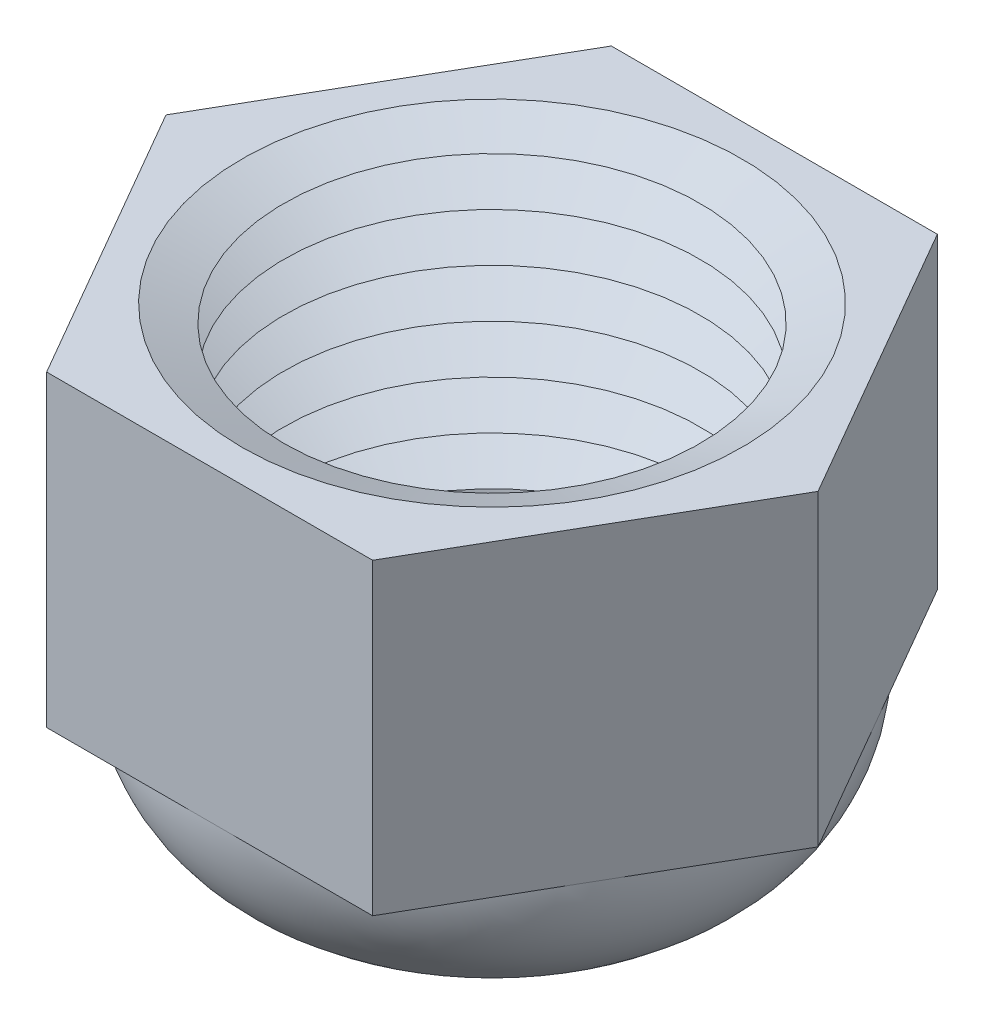
ISO-10303-21;
HEADER;
FILE_DESCRIPTION(('STEP AP214'),'2;1');
FILE_NAME('part.step','',(''),(''),'','','');
FILE_SCHEMA(('AUTOMOTIVE_DESIGN { 1 0 10303 214 1 1 1 1 }'));
ENDSEC;
DATA;
#1=APPLICATION_CONTEXT('core data for automotive mechanical design processes');
#2=APPLICATION_PROTOCOL_DEFINITION('international standard','automotive_design',2000,#1);
#3=PRODUCT_CONTEXT('',#1,'mechanical');
#4=PRODUCT('Part','Part','',(#3));
#5=PRODUCT_RELATED_PRODUCT_CATEGORY('part','',(#4));
#6=PRODUCT_DEFINITION_FORMATION('','',#4);
#7=PRODUCT_DEFINITION_CONTEXT('part definition',#1,'design');
#8=PRODUCT_DEFINITION('design','',#6,#7);
#9=PRODUCT_DEFINITION_SHAPE('','',#8);
#10=(LENGTH_UNIT() NAMED_UNIT(*) SI_UNIT(.MILLI.,.METRE.));
#11=(NAMED_UNIT(*) PLANE_ANGLE_UNIT() SI_UNIT($,.RADIAN.));
#12=(NAMED_UNIT(*) SI_UNIT($,.STERADIAN.) SOLID_ANGLE_UNIT());
#13=UNCERTAINTY_MEASURE_WITH_UNIT(LENGTH_MEASURE(1.E-05),#10,'distance_accuracy_value','');
#14=(GEOMETRIC_REPRESENTATION_CONTEXT(3) GLOBAL_UNCERTAINTY_ASSIGNED_CONTEXT((#13)) GLOBAL_UNIT_ASSIGNED_CONTEXT((#10,
#11,#12)) REPRESENTATION_CONTEXT('',''));
#15=CARTESIAN_POINT('',(0.,0.,0.));
#16=DIRECTION('',(0.,0.,1.));
#17=DIRECTION('',(1.,0.,0.));
#18=AXIS2_PLACEMENT_3D('',#15,#16,#17);
#19=CARTESIAN_POINT('',(10.9696551146029,-5.18,0.));
#20=DIRECTION('',(0.,1.,0.));
#21=DIRECTION('',(0.,0.,1.));
#22=AXIS2_PLACEMENT_3D('',#19,#20,#21);
#23=PLANE('',#22);
#24=CARTESIAN_POINT('',(0.,-5.18,0.));
#25=DIRECTION('',(0.,-1.,0.));
#26=DIRECTION('',(0.,0.,-1.));
#27=AXIS2_PLACEMENT_3D('',#24,#25,#26);
#28=CIRCLE('',#27,9.50000000000001);
#29=CARTESIAN_POINT('',(0.,-5.18,-9.50000000000001));
#30=VERTEX_POINT('',#29);
#31=CARTESIAN_POINT('',(8.22724133595217,-5.18,-4.75));
#32=VERTEX_POINT('',#31);
#33=EDGE_CURVE('E127',#30,#32,#28,.T.);
#34=ORIENTED_EDGE('',*,*,#33,.F.);
#35=DIRECTION('',(-1.,0.,0.));
#36=VECTOR('',#35,1.);
#37=CARTESIAN_POINT('',(5.48482755730144,-5.18,-9.50000000000002));
#38=LINE('',#37,#36);
#39=CARTESIAN_POINT('',(5.48482755730144,-5.18,-9.50000000000002));
#40=VERTEX_POINT('',#39);
#41=EDGE_CURVE('E105',#40,#30,#38,.T.);
#42=ORIENTED_EDGE('',*,*,#41,.F.);
#43=DIRECTION('',(-0.5,0.,-0.866025403784439));
#44=VECTOR('',#43,1.);
#45=CARTESIAN_POINT('',(10.9696551146029,-5.18,0.));
#46=LINE('',#45,#44);
#47=EDGE_CURVE('E128',#32,#40,#46,.T.);
#48=ORIENTED_EDGE('',*,*,#47,.F.);
#49=EDGE_LOOP('',(#34,#42,#48));
#50=FACE_BOUND('',#49,.T.);
#51=ADVANCED_FACE('F32',(#50),#23,.F.);
#52=CARTESIAN_POINT('',(8.22724133595217,-5.18,4.75));
#53=VERTEX_POINT('',#52);
#54=EDGE_CURVE('E40',#32,#53,#28,.T.);
#55=ORIENTED_EDGE('',*,*,#54,.F.);
#56=CARTESIAN_POINT('',(10.9696551146029,-5.18,0.));
#57=VERTEX_POINT('',#56);
#58=EDGE_CURVE('E125',#57,#32,#46,.T.);
#59=ORIENTED_EDGE('',*,*,#58,.F.);
#60=DIRECTION('',(0.5,0.,-0.866025403784439));
#61=VECTOR('',#60,1.);
#62=CARTESIAN_POINT('',(5.48482755730145,-5.18,9.50000000000001));
#63=LINE('',#62,#61);
#64=EDGE_CURVE('E180',#53,#57,#63,.T.);
#65=ORIENTED_EDGE('',*,*,#64,.F.);
#66=EDGE_LOOP('',(#55,#59,#65));
#67=FACE_BOUND('',#66,.T.);
#68=ADVANCED_FACE('F236',(#67),#23,.F.);
#69=CARTESIAN_POINT('',(0.,-5.18,9.50000000000001));
#70=VERTEX_POINT('',#69);
#71=EDGE_CURVE('E269',#53,#70,#28,.T.);
#72=ORIENTED_EDGE('',*,*,#71,.F.);
#73=CARTESIAN_POINT('',(5.48482755730145,-5.18,9.50000000000001));
#74=VERTEX_POINT('',#73);
#75=EDGE_CURVE('E196',#74,#53,#63,.T.);
#76=ORIENTED_EDGE('',*,*,#75,.F.);
#77=DIRECTION('',(1.,0.,0.));
#78=VECTOR('',#77,1.);
#79=CARTESIAN_POINT('',(-5.48482755730145,-5.18,9.50000000000001));
#80=LINE('',#79,#78);
#81=EDGE_CURVE('E205',#70,#74,#80,.T.);
#82=ORIENTED_EDGE('',*,*,#81,.F.);
#83=EDGE_LOOP('',(#72,#76,#82));
#84=FACE_BOUND('',#83,.T.);
#85=ADVANCED_FACE('F241',(#84),#23,.F.);
#86=CARTESIAN_POINT('',(-8.22724133595218,-5.18,4.75000000000001));
#87=VERTEX_POINT('',#86);
#88=EDGE_CURVE('E135',#70,#87,#28,.T.);
#89=ORIENTED_EDGE('',*,*,#88,.F.);
#90=CARTESIAN_POINT('',(-5.48482755730145,-5.18,9.50000000000001));
#91=VERTEX_POINT('',#90);
#92=EDGE_CURVE('E185',#91,#70,#80,.T.);
#93=ORIENTED_EDGE('',*,*,#92,.F.);
#94=DIRECTION('',(0.5,0.,0.866025403784439));
#95=VECTOR('',#94,1.);
#96=CARTESIAN_POINT('',(-10.9696551146029,-5.18,0.));
#97=LINE('',#96,#95);
#98=EDGE_CURVE('E201',#87,#91,#97,.T.);
#99=ORIENTED_EDGE('',*,*,#98,.F.);
#100=EDGE_LOOP('',(#89,#93,#99));
#101=FACE_BOUND('',#100,.T.);
#102=ADVANCED_FACE('F253',(#101),#23,.F.);
#103=CARTESIAN_POINT('',(-8.22724133595218,-5.18,-4.75));
#104=VERTEX_POINT('',#103);
#105=EDGE_CURVE('E54',#87,#104,#28,.T.);
#106=ORIENTED_EDGE('',*,*,#105,.F.);
#107=CARTESIAN_POINT('',(-10.9696551146029,-5.18,0.));
#108=VERTEX_POINT('',#107);
#109=EDGE_CURVE('E202',#108,#87,#97,.T.);
#110=ORIENTED_EDGE('',*,*,#109,.F.);
#111=DIRECTION('',(-0.5,0.,0.866025403784439));
#112=VECTOR('',#111,1.);
#113=CARTESIAN_POINT('',(-5.48482755730145,-5.18,-9.50000000000002));
#114=LINE('',#113,#112);
#115=EDGE_CURVE('E116',#104,#108,#114,.T.);
#116=ORIENTED_EDGE('',*,*,#115,.F.);
#117=EDGE_LOOP('',(#106,#110,#116));
#118=FACE_BOUND('',#117,.T.);
#119=ADVANCED_FACE('F246',(#118),#23,.F.);
#120=EDGE_CURVE('E121',#104,#30,#28,.T.);
#121=ORIENTED_EDGE('',*,*,#120,.F.);
#122=CARTESIAN_POINT('',(-5.48482755730145,-5.18,-9.50000000000002));
#123=VERTEX_POINT('',#122);
#124=EDGE_CURVE('E124',#123,#104,#114,.T.);
#125=ORIENTED_EDGE('',*,*,#124,.F.);
#126=EDGE_CURVE('E109',#30,#123,#38,.T.);
#127=ORIENTED_EDGE('',*,*,#126,.F.);
#128=EDGE_LOOP('',(#121,#125,#127));
#129=FACE_BOUND('',#128,.T.);
#130=ADVANCED_FACE('F120',(#129),#23,.F.);
#131=CARTESIAN_POINT('',(5.48482755730145,5.18,9.50000000000001));
#132=DIRECTION('',(-0.866025403784439,0.,-0.5));
#133=DIRECTION('',(-0.5,0.,0.866025403784439));
#134=AXIS2_PLACEMENT_3D('',#131,#132,#133);
#135=PLANE('',#134);
#136=ORIENTED_EDGE('',*,*,#75,.T.);
#137=ORIENTED_EDGE('',*,*,#64,.T.);
#138=DIRECTION('',(0.,-1.,0.));
#139=VECTOR('',#138,1.);
#140=CARTESIAN_POINT('',(10.9696551146029,5.18,0.));
#141=LINE('',#140,#139);
#142=CARTESIAN_POINT('',(10.9696551146029,5.18,0.));
#143=VERTEX_POINT('',#142);
#144=EDGE_CURVE('E134',#143,#57,#141,.T.);
#145=ORIENTED_EDGE('',*,*,#144,.F.);
#146=DIRECTION('',(0.5,0.,-0.866025403784439));
#147=VECTOR('',#146,1.);
#148=CARTESIAN_POINT('',(5.48482755730145,5.18,9.50000000000001));
#149=LINE('',#148,#147);
#150=CARTESIAN_POINT('',(5.48482755730145,5.18,9.50000000000001));
#151=VERTEX_POINT('',#150);
#152=EDGE_CURVE('E181',#151,#143,#149,.T.);
#153=ORIENTED_EDGE('',*,*,#152,.F.);
#154=DIRECTION('',(0.,-1.,0.));
#155=VECTOR('',#154,1.);
#156=CARTESIAN_POINT('',(5.48482755730145,5.18,9.50000000000001));
#157=LINE('',#156,#155);
#158=EDGE_CURVE('E195',#151,#74,#157,.T.);
#159=ORIENTED_EDGE('',*,*,#158,.T.);
#160=EDGE_LOOP('',(#136,#137,#145,#153,#159));
#161=FACE_BOUND('',#160,.T.);
#162=ADVANCED_FACE('F245',(#161),#135,.F.);
#163=CARTESIAN_POINT('',(10.9696551146029,5.18,0.));
#164=DIRECTION('',(-0.866025403784439,0.,0.5));
#165=DIRECTION('',(0.5,0.,0.866025403784439));
#166=AXIS2_PLACEMENT_3D('',#163,#164,#165);
#167=PLANE('',#166);
#168=ORIENTED_EDGE('',*,*,#58,.T.);
#169=ORIENTED_EDGE('',*,*,#47,.T.);
#170=DIRECTION('',(0.,-1.,0.));
#171=VECTOR('',#170,1.);
#172=CARTESIAN_POINT('',(5.48482755730144,5.18,-9.50000000000002));
#173=LINE('',#172,#171);
#174=CARTESIAN_POINT('',(5.48482755730144,5.18,-9.50000000000002));
#175=VERTEX_POINT('',#174);
#176=EDGE_CURVE('E113',#175,#40,#173,.T.);
#177=ORIENTED_EDGE('',*,*,#176,.F.);
#178=DIRECTION('',(-0.5,0.,-0.866025403784439));
#179=VECTOR('',#178,1.);
#180=CARTESIAN_POINT('',(10.9696551146029,5.18,0.));
#181=LINE('',#180,#179);
#182=EDGE_CURVE('E184',#143,#175,#181,.T.);
#183=ORIENTED_EDGE('',*,*,#182,.F.);
#184=ORIENTED_EDGE('',*,*,#144,.T.);
#185=EDGE_LOOP('',(#168,#169,#177,#183,#184));
#186=FACE_BOUND('',#185,.T.);
#187=ADVANCED_FACE('F251',(#186),#167,.F.);
#188=CARTESIAN_POINT('',(5.48482755730144,5.18,-9.50000000000002));
#189=DIRECTION('',(0.,0.,1.));
#190=DIRECTION('',(1.,0.,0.));
#191=AXIS2_PLACEMENT_3D('',#188,#189,#190);
#192=PLANE('',#191);
#193=ORIENTED_EDGE('',*,*,#41,.T.);
#194=ORIENTED_EDGE('',*,*,#126,.T.);
#195=DIRECTION('',(0.,-1.,0.));
#196=VECTOR('',#195,1.);
#197=CARTESIAN_POINT('',(-5.48482755730145,5.18,-9.50000000000002));
#198=LINE('',#197,#196);
#199=CARTESIAN_POINT('',(-5.48482755730145,5.18,-9.50000000000002));
#200=VERTEX_POINT('',#199);
#201=EDGE_CURVE('E216',#200,#123,#198,.T.);
#202=ORIENTED_EDGE('',*,*,#201,.F.);
#203=DIRECTION('',(-1.,0.,0.));
#204=VECTOR('',#203,1.);
#205=CARTESIAN_POINT('',(5.48482755730144,5.18,-9.50000000000002));
#206=LINE('',#205,#204);
#207=EDGE_CURVE('E187',#175,#200,#206,.T.);
#208=ORIENTED_EDGE('',*,*,#207,.F.);
#209=ORIENTED_EDGE('',*,*,#176,.T.);
#210=EDGE_LOOP('',(#193,#194,#202,#208,#209));
#211=FACE_BOUND('',#210,.T.);
#212=ADVANCED_FACE('F107',(#211),#192,.F.);
#213=CARTESIAN_POINT('',(-5.48482755730145,5.18,-9.50000000000002));
#214=DIRECTION('',(0.866025403784439,0.,0.5));
#215=DIRECTION('',(0.5,0.,-0.866025403784439));
#216=AXIS2_PLACEMENT_3D('',#213,#214,#215);
#217=PLANE('',#216);
#218=ORIENTED_EDGE('',*,*,#124,.T.);
#219=ORIENTED_EDGE('',*,*,#115,.T.);
#220=DIRECTION('',(0.,-1.,0.));
#221=VECTOR('',#220,1.);
#222=CARTESIAN_POINT('',(-10.9696551146029,5.18,0.));
#223=LINE('',#222,#221);
#224=CARTESIAN_POINT('',(-10.9696551146029,5.18,0.));
#225=VERTEX_POINT('',#224);
#226=EDGE_CURVE('E213',#225,#108,#223,.T.);
#227=ORIENTED_EDGE('',*,*,#226,.F.);
#228=DIRECTION('',(-0.5,0.,0.866025403784439));
#229=VECTOR('',#228,1.);
#230=CARTESIAN_POINT('',(-5.48482755730145,5.18,-9.50000000000002));
#231=LINE('',#230,#229);
#232=EDGE_CURVE('E189',#200,#225,#231,.T.);
#233=ORIENTED_EDGE('',*,*,#232,.F.);
#234=ORIENTED_EDGE('',*,*,#201,.T.);
#235=EDGE_LOOP('',(#218,#219,#227,#233,#234));
#236=FACE_BOUND('',#235,.T.);
#237=ADVANCED_FACE('F282',(#236),#217,.F.);
#238=CARTESIAN_POINT('',(-10.9696551146029,5.18,0.));
#239=DIRECTION('',(0.866025403784439,0.,-0.5));
#240=DIRECTION('',(-0.5,0.,-0.866025403784439));
#241=AXIS2_PLACEMENT_3D('',#238,#239,#240);
#242=PLANE('',#241);
#243=ORIENTED_EDGE('',*,*,#109,.T.);
#244=ORIENTED_EDGE('',*,*,#98,.T.);
#245=DIRECTION('',(0.,-1.,0.));
#246=VECTOR('',#245,1.);
#247=CARTESIAN_POINT('',(-5.48482755730145,5.18,9.50000000000001));
#248=LINE('',#247,#246);
#249=CARTESIAN_POINT('',(-5.48482755730145,5.18,9.50000000000001));
#250=VERTEX_POINT('',#249);
#251=EDGE_CURVE('E210',#250,#91,#248,.T.);
#252=ORIENTED_EDGE('',*,*,#251,.F.);
#253=DIRECTION('',(0.5,0.,0.866025403784439));
#254=VECTOR('',#253,1.);
#255=CARTESIAN_POINT('',(-10.9696551146029,5.18,0.));
#256=LINE('',#255,#254);
#257=EDGE_CURVE('E191',#225,#250,#256,.T.);
#258=ORIENTED_EDGE('',*,*,#257,.F.);
#259=ORIENTED_EDGE('',*,*,#226,.T.);
#260=EDGE_LOOP('',(#243,#244,#252,#258,#259));
#261=FACE_BOUND('',#260,.T.);
#262=ADVANCED_FACE('F265',(#261),#242,.F.);
#263=CARTESIAN_POINT('',(-5.48482755730145,5.18,9.50000000000001));
#264=DIRECTION('',(0.,0.,-1.));
#265=DIRECTION('',(-1.,0.,0.));
#266=AXIS2_PLACEMENT_3D('',#263,#264,#265);
#267=PLANE('',#266);
#268=ORIENTED_EDGE('',*,*,#92,.T.);
#269=ORIENTED_EDGE('',*,*,#81,.T.);
#270=ORIENTED_EDGE('',*,*,#158,.F.);
#271=DIRECTION('',(1.,0.,0.));
#272=VECTOR('',#271,1.);
#273=CARTESIAN_POINT('',(-5.48482755730145,5.18,9.50000000000001));
#274=LINE('',#273,#272);
#275=EDGE_CURVE('E193',#250,#151,#274,.T.);
#276=ORIENTED_EDGE('',*,*,#275,.F.);
#277=ORIENTED_EDGE('',*,*,#251,.T.);
#278=EDGE_LOOP('',(#268,#269,#270,#276,#277));
#279=FACE_BOUND('',#278,.T.);
#280=ADVANCED_FACE('F277',(#279),#267,.F.);
#281=CARTESIAN_POINT('',(10.9696551146029,5.18,0.));
#282=DIRECTION('',(0.,1.,0.));
#283=DIRECTION('',(0.,0.,1.));
#284=AXIS2_PLACEMENT_3D('',#281,#282,#283);
#285=PLANE('',#284);
#286=CARTESIAN_POINT('',(0.,5.18,0.));
#287=DIRECTION('',(0.,1.,0.));
#288=DIRECTION('',(0.,0.,1.));
#289=AXIS2_PLACEMENT_3D('',#286,#287,#288);
#290=CIRCLE('',#289,8.41);
#291=CARTESIAN_POINT('',(0.,5.18,8.41));
#292=VERTEX_POINT('',#291);
#293=EDGE_CURVE('E177',#292,#292,#290,.T.);
#294=ORIENTED_EDGE('',*,*,#293,.F.);
#295=EDGE_LOOP('',(#294));
#296=FACE_BOUND('',#295,.T.);
#297=ORIENTED_EDGE('',*,*,#152,.T.);
#298=ORIENTED_EDGE('',*,*,#182,.T.);
#299=ORIENTED_EDGE('',*,*,#207,.T.);
#300=ORIENTED_EDGE('',*,*,#232,.T.);
#301=ORIENTED_EDGE('',*,*,#257,.T.);
#302=ORIENTED_EDGE('',*,*,#275,.T.);
#303=EDGE_LOOP('',(#297,#298,#299,#300,#301,#302));
#304=FACE_BOUND('',#303,.T.);
#305=ADVANCED_FACE('F279',(#296,#304),#285,.T.);
#306=CARTESIAN_POINT('',(0.,5.18,0.));
#307=DIRECTION('',(0.,1.,0.));
#308=DIRECTION('',(0.,0.,1.));
#309=AXIS2_PLACEMENT_3D('',#306,#307,#308);
#310=CONICAL_SURFACE('',#309,8.41,1.17375118762767);
#311=CARTESIAN_POINT('',(0.,4.58876655468834,0.));
#312=DIRECTION('',(0.,1.,0.));
#313=DIRECTION('',(0.,0.,1.));
#314=AXIS2_PLACEMENT_3D('',#311,#312,#313);
#315=CIRCLE('',#314,7.);
#316=CARTESIAN_POINT('',(0.,4.58876655468834,7.));
#317=VERTEX_POINT('',#316);
#318=EDGE_CURVE('E174',#317,#317,#315,.T.);
#319=ORIENTED_EDGE('',*,*,#318,.F.);
#320=EDGE_LOOP('',(#319));
#321=FACE_BOUND('',#320,.T.);
#322=ORIENTED_EDGE('',*,*,#293,.T.);
#323=EDGE_LOOP('',(#322));
#324=FACE_BOUND('',#323,.T.);
#325=ADVANCED_FACE('F412',(#321,#324),#310,.F.);
#326=CARTESIAN_POINT('',(0.,4.58876655468834,0.));
#327=DIRECTION('',(0.,-1.,0.));
#328=DIRECTION('',(0.,0.,-1.));
#329=AXIS2_PLACEMENT_3D('',#326,#327,#328);
#330=CONICAL_SURFACE('',#329,7.,1.0471975511966);
#331=CARTESIAN_POINT('',(0.,3.77470267513098,0.));
#332=DIRECTION('',(0.,1.,0.));
#333=DIRECTION('',(0.,0.,1.));
#334=AXIS2_PLACEMENT_3D('',#331,#332,#333);
#335=CIRCLE('',#334,8.41);
#336=CARTESIAN_POINT('',(0.,3.77470267513098,8.41));
#337=VERTEX_POINT('',#336);
#338=EDGE_CURVE('E171',#337,#337,#335,.T.);
#339=ORIENTED_EDGE('',*,*,#338,.F.);
#340=EDGE_LOOP('',(#339));
#341=FACE_BOUND('',#340,.T.);
#342=ORIENTED_EDGE('',*,*,#318,.T.);
#343=EDGE_LOOP('',(#342));
#344=FACE_BOUND('',#343,.T.);
#345=ADVANCED_FACE('F406',(#341,#344),#330,.F.);
#346=CARTESIAN_POINT('',(0.,3.77470267513098,0.));
#347=DIRECTION('',(0.,1.,0.));
#348=DIRECTION('',(0.,0.,1.));
#349=AXIS2_PLACEMENT_3D('',#346,#347,#348);
#350=CONICAL_SURFACE('',#349,8.41,1.0471975511966);
#351=CARTESIAN_POINT('',(0.,2.96063879557361,0.));
#352=DIRECTION('',(0.,1.,0.));
#353=DIRECTION('',(0.,0.,1.));
#354=AXIS2_PLACEMENT_3D('',#351,#352,#353);
#355=CIRCLE('',#354,7.);
#356=CARTESIAN_POINT('',(0.,2.96063879557361,7.));
#357=VERTEX_POINT('',#356);
#358=EDGE_CURVE('E168',#357,#357,#355,.T.);
#359=ORIENTED_EDGE('',*,*,#358,.F.);
#360=EDGE_LOOP('',(#359));
#361=FACE_BOUND('',#360,.T.);
#362=ORIENTED_EDGE('',*,*,#338,.T.);
#363=EDGE_LOOP('',(#362));
#364=FACE_BOUND('',#363,.T.);
#365=ADVANCED_FACE('F400',(#361,#364),#350,.F.);
#366=CARTESIAN_POINT('',(0.,2.96063879557361,0.));
#367=DIRECTION('',(0.,-1.,0.));
#368=DIRECTION('',(0.,0.,-1.));
#369=AXIS2_PLACEMENT_3D('',#366,#367,#368);
#370=CONICAL_SURFACE('',#369,7.,1.0471975511966);
#371=CARTESIAN_POINT('',(0.,2.14657491601625,0.));
#372=DIRECTION('',(0.,1.,0.));
#373=DIRECTION('',(0.,0.,1.));
#374=AXIS2_PLACEMENT_3D('',#371,#372,#373);
#375=CIRCLE('',#374,8.41);
#376=CARTESIAN_POINT('',(0.,2.14657491601625,8.41));
#377=VERTEX_POINT('',#376);
#378=EDGE_CURVE('E165',#377,#377,#375,.T.);
#379=ORIENTED_EDGE('',*,*,#378,.F.);
#380=EDGE_LOOP('',(#379));
#381=FACE_BOUND('',#380,.T.);
#382=ORIENTED_EDGE('',*,*,#358,.T.);
#383=EDGE_LOOP('',(#382));
#384=FACE_BOUND('',#383,.T.);
#385=ADVANCED_FACE('F394',(#381,#384),#370,.F.);
#386=CARTESIAN_POINT('',(0.,2.14657491601625,0.));
#387=DIRECTION('',(0.,1.,0.));
#388=DIRECTION('',(0.,0.,1.));
#389=AXIS2_PLACEMENT_3D('',#386,#387,#388);
#390=CONICAL_SURFACE('',#389,8.41,1.0471975511966);
#391=CARTESIAN_POINT('',(0.,1.33251103645889,0.));
#392=DIRECTION('',(0.,1.,0.));
#393=DIRECTION('',(0.,0.,1.));
#394=AXIS2_PLACEMENT_3D('',#391,#392,#393);
#395=CIRCLE('',#394,7.);
#396=CARTESIAN_POINT('',(0.,1.33251103645889,7.));
#397=VERTEX_POINT('',#396);
#398=EDGE_CURVE('E162',#397,#397,#395,.T.);
#399=ORIENTED_EDGE('',*,*,#398,.F.);
#400=EDGE_LOOP('',(#399));
#401=FACE_BOUND('',#400,.T.);
#402=ORIENTED_EDGE('',*,*,#378,.T.);
#403=EDGE_LOOP('',(#402));
#404=FACE_BOUND('',#403,.T.);
#405=ADVANCED_FACE('F388',(#401,#404),#390,.F.);
#406=CARTESIAN_POINT('',(0.,1.33251103645889,0.));
#407=DIRECTION('',(0.,-1.,0.));
#408=DIRECTION('',(0.,0.,-1.));
#409=AXIS2_PLACEMENT_3D('',#406,#407,#408);
#410=CONICAL_SURFACE('',#409,7.,1.0471975511966);
#411=CARTESIAN_POINT('',(0.,0.51844715690153,0.));
#412=DIRECTION('',(0.,1.,0.));
#413=DIRECTION('',(0.,0.,1.));
#414=AXIS2_PLACEMENT_3D('',#411,#412,#413);
#415=CIRCLE('',#414,8.41);
#416=CARTESIAN_POINT('',(0.,0.51844715690153,8.41));
#417=VERTEX_POINT('',#416);
#418=EDGE_CURVE('E159',#417,#417,#415,.T.);
#419=ORIENTED_EDGE('',*,*,#418,.F.);
#420=EDGE_LOOP('',(#419));
#421=FACE_BOUND('',#420,.T.);
#422=ORIENTED_EDGE('',*,*,#398,.T.);
#423=EDGE_LOOP('',(#422));
#424=FACE_BOUND('',#423,.T.);
#425=ADVANCED_FACE('F382',(#421,#424),#410,.F.);
#426=CARTESIAN_POINT('',(0.,0.51844715690153,0.));
#427=DIRECTION('',(0.,1.,0.));
#428=DIRECTION('',(0.,0.,1.));
#429=AXIS2_PLACEMENT_3D('',#426,#427,#428);
#430=CONICAL_SURFACE('',#429,8.41,1.0471975511966);
#431=CARTESIAN_POINT('',(0.,-0.295616722655832,0.));
#432=DIRECTION('',(0.,1.,0.));
#433=DIRECTION('',(0.,0.,1.));
#434=AXIS2_PLACEMENT_3D('',#431,#432,#433);
#435=CIRCLE('',#434,7.);
#436=CARTESIAN_POINT('',(0.,-0.295616722655832,7.));
#437=VERTEX_POINT('',#436);
#438=EDGE_CURVE('E156',#437,#437,#435,.T.);
#439=ORIENTED_EDGE('',*,*,#438,.F.);
#440=EDGE_LOOP('',(#439));
#441=FACE_BOUND('',#440,.T.);
#442=ORIENTED_EDGE('',*,*,#418,.T.);
#443=EDGE_LOOP('',(#442));
#444=FACE_BOUND('',#443,.T.);
#445=ADVANCED_FACE('F376',(#441,#444),#430,.F.);
#446=CARTESIAN_POINT('',(0.,-0.295616722655832,0.));
#447=DIRECTION('',(0.,-1.,0.));
#448=DIRECTION('',(0.,0.,-1.));
#449=AXIS2_PLACEMENT_3D('',#446,#447,#448);
#450=CONICAL_SURFACE('',#449,7.,1.0471975511966);
#451=CARTESIAN_POINT('',(0.,-1.10968060221319,0.));
#452=DIRECTION('',(0.,1.,0.));
#453=DIRECTION('',(0.,0.,1.));
#454=AXIS2_PLACEMENT_3D('',#451,#452,#453);
#455=CIRCLE('',#454,8.41);
#456=CARTESIAN_POINT('',(0.,-1.10968060221319,8.41));
#457=VERTEX_POINT('',#456);
#458=EDGE_CURVE('E153',#457,#457,#455,.T.);
#459=ORIENTED_EDGE('',*,*,#458,.F.);
#460=EDGE_LOOP('',(#459));
#461=FACE_BOUND('',#460,.T.);
#462=ORIENTED_EDGE('',*,*,#438,.T.);
#463=EDGE_LOOP('',(#462));
#464=FACE_BOUND('',#463,.T.);
#465=ADVANCED_FACE('F370',(#461,#464),#450,.F.);
#466=CARTESIAN_POINT('',(0.,-1.10968060221319,0.));
#467=DIRECTION('',(0.,1.,0.));
#468=DIRECTION('',(0.,0.,1.));
#469=AXIS2_PLACEMENT_3D('',#466,#467,#468);
#470=CONICAL_SURFACE('',#469,8.41,1.0471975511966);
#471=CARTESIAN_POINT('',(0.,-1.92374448177055,0.));
#472=DIRECTION('',(0.,1.,0.));
#473=DIRECTION('',(0.,0.,1.));
#474=AXIS2_PLACEMENT_3D('',#471,#472,#473);
#475=CIRCLE('',#474,7.);
#476=CARTESIAN_POINT('',(0.,-1.92374448177055,7.));
#477=VERTEX_POINT('',#476);
#478=EDGE_CURVE('E150',#477,#477,#475,.T.);
#479=ORIENTED_EDGE('',*,*,#478,.F.);
#480=EDGE_LOOP('',(#479));
#481=FACE_BOUND('',#480,.T.);
#482=ORIENTED_EDGE('',*,*,#458,.T.);
#483=EDGE_LOOP('',(#482));
#484=FACE_BOUND('',#483,.T.);
#485=ADVANCED_FACE('F364',(#481,#484),#470,.F.);
#486=CARTESIAN_POINT('',(0.,-1.92374448177055,0.));
#487=DIRECTION('',(0.,-1.,0.));
#488=DIRECTION('',(0.,0.,-1.));
#489=AXIS2_PLACEMENT_3D('',#486,#487,#488);
#490=CONICAL_SURFACE('',#489,7.,1.0471975511966);
#491=CARTESIAN_POINT('',(0.,-2.73780836132791,0.));
#492=DIRECTION('',(0.,1.,0.));
#493=DIRECTION('',(0.,0.,1.));
#494=AXIS2_PLACEMENT_3D('',#491,#492,#493);
#495=CIRCLE('',#494,8.41);
#496=CARTESIAN_POINT('',(0.,-2.73780836132791,8.41));
#497=VERTEX_POINT('',#496);
#498=EDGE_CURVE('E147',#497,#497,#495,.T.);
#499=ORIENTED_EDGE('',*,*,#498,.F.);
#500=EDGE_LOOP('',(#499));
#501=FACE_BOUND('',#500,.T.);
#502=ORIENTED_EDGE('',*,*,#478,.T.);
#503=EDGE_LOOP('',(#502));
#504=FACE_BOUND('',#503,.T.);
#505=ADVANCED_FACE('F358',(#501,#504),#490,.F.);
#506=CARTESIAN_POINT('',(0.,-2.73780836132791,0.));
#507=DIRECTION('',(0.,1.,0.));
#508=DIRECTION('',(0.,0.,1.));
#509=AXIS2_PLACEMENT_3D('',#506,#507,#508);
#510=CONICAL_SURFACE('',#509,8.41,1.0471975511966);
#511=CARTESIAN_POINT('',(0.,-3.55187224088528,0.));
#512=DIRECTION('',(0.,1.,0.));
#513=DIRECTION('',(0.,0.,1.));
#514=AXIS2_PLACEMENT_3D('',#511,#512,#513);
#515=CIRCLE('',#514,7.);
#516=CARTESIAN_POINT('',(0.,-3.55187224088528,7.));
#517=VERTEX_POINT('',#516);
#518=EDGE_CURVE('E144',#517,#517,#515,.T.);
#519=ORIENTED_EDGE('',*,*,#518,.F.);
#520=EDGE_LOOP('',(#519));
#521=FACE_BOUND('',#520,.T.);
#522=ORIENTED_EDGE('',*,*,#498,.T.);
#523=EDGE_LOOP('',(#522));
#524=FACE_BOUND('',#523,.T.);
#525=ADVANCED_FACE('F352',(#521,#524),#510,.F.);
#526=CARTESIAN_POINT('',(0.,-3.55187224088528,0.));
#527=DIRECTION('',(0.,-1.,0.));
#528=DIRECTION('',(0.,0.,-1.));
#529=AXIS2_PLACEMENT_3D('',#526,#527,#528);
#530=CONICAL_SURFACE('',#529,7.,1.0471975511966);
#531=CARTESIAN_POINT('',(0.,-4.36593612044264,0.));
#532=DIRECTION('',(0.,1.,0.));
#533=DIRECTION('',(0.,0.,1.));
#534=AXIS2_PLACEMENT_3D('',#531,#532,#533);
#535=CIRCLE('',#534,8.41);
#536=CARTESIAN_POINT('',(0.,-4.36593612044264,8.41));
#537=VERTEX_POINT('',#536);
#538=EDGE_CURVE('E141',#537,#537,#535,.T.);
#539=ORIENTED_EDGE('',*,*,#538,.F.);
#540=EDGE_LOOP('',(#539));
#541=FACE_BOUND('',#540,.T.);
#542=ORIENTED_EDGE('',*,*,#518,.T.);
#543=EDGE_LOOP('',(#542));
#544=FACE_BOUND('',#543,.T.);
#545=ADVANCED_FACE('F231',(#541,#544),#530,.F.);
#546=CARTESIAN_POINT('',(0.,-4.36593612044264,0.));
#547=DIRECTION('',(0.,1.,0.));
#548=DIRECTION('',(0.,0.,1.));
#549=AXIS2_PLACEMENT_3D('',#546,#547,#548);
#550=CONICAL_SURFACE('',#549,8.41,1.0471975511966);
#551=CARTESIAN_POINT('',(0.,-5.18,0.));
#552=DIRECTION('',(0.,1.,0.));
#553=DIRECTION('',(0.,0.,1.));
#554=AXIS2_PLACEMENT_3D('',#551,#552,#553);
#555=CIRCLE('',#554,7.);
#556=CARTESIAN_POINT('',(0.,-5.18,7.));
#557=VERTEX_POINT('',#556);
#558=EDGE_CURVE('E130',#557,#557,#555,.T.);
#559=ORIENTED_EDGE('',*,*,#558,.F.);
#560=EDGE_LOOP('',(#559));
#561=FACE_BOUND('',#560,.T.);
#562=ORIENTED_EDGE('',*,*,#538,.T.);
#563=EDGE_LOOP('',(#562));
#564=FACE_BOUND('',#563,.T.);
#565=ADVANCED_FACE('F224',(#561,#564),#550,.F.);
#566=CARTESIAN_POINT('',(0.,-5.18,0.));
#567=DIRECTION('',(0.,-1.,0.));
#568=DIRECTION('',(0.,0.,-1.));
#569=AXIS2_PLACEMENT_3D('',#566,#567,#568);
#570=DEGENERATE_TOROIDAL_SURFACE('',#569,4.50000000000001,5.,.T.);
#571=CARTESIAN_POINT('',(0.,-9.56634243989227,0.));
#572=DIRECTION('',(0.,1.,0.));
#573=DIRECTION('',(0.,0.,1.));
#574=AXIS2_PLACEMENT_3D('',#571,#572,#573);
#575=CIRCLE('',#574,6.9);
#576=CARTESIAN_POINT('',(0.,-9.56634243989227,6.9));
#577=VERTEX_POINT('',#576);
#578=EDGE_CURVE('E131',#577,#577,#575,.F.);
#579=ORIENTED_EDGE('',*,*,#578,.F.);
#580=EDGE_LOOP('',(#579));
#581=FACE_BOUND('',#580,.T.);
#582=ORIENTED_EDGE('',*,*,#105,.T.);
#583=ORIENTED_EDGE('',*,*,#120,.T.);
#584=ORIENTED_EDGE('',*,*,#33,.T.);
#585=ORIENTED_EDGE('',*,*,#54,.T.);
#586=ORIENTED_EDGE('',*,*,#71,.T.);
#587=ORIENTED_EDGE('',*,*,#88,.T.);
#588=EDGE_LOOP('',(#582,#583,#584,#585,#586,#587));
#589=FACE_BOUND('',#588,.T.);
#590=ADVANCED_FACE('F133',(#581,#589),#570,.T.);
#591=CARTESIAN_POINT('',(0.,-5.18,0.));
#592=DIRECTION('',(0.,-1.,0.));
#593=DIRECTION('',(0.,0.,-1.));
#594=AXIS2_PLACEMENT_3D('',#591,#592,#593);
#595=CYLINDRICAL_SURFACE('',#594,6.9);
#596=CARTESIAN_POINT('',(0.,-6.1749874371066,0.));
#597=DIRECTION('',(0.,1.,0.));
#598=DIRECTION('',(0.,0.,1.));
#599=AXIS2_PLACEMENT_3D('',#596,#597,#598);
#600=CIRCLE('',#599,6.9);
#601=CARTESIAN_POINT('',(0.,-6.1749874371066,6.9));
#602=VERTEX_POINT('',#601);
#603=EDGE_CURVE('E11',#602,#602,#600,.T.);
#604=ORIENTED_EDGE('',*,*,#603,.T.);
#605=EDGE_LOOP('',(#604));
#606=FACE_BOUND('',#605,.T.);
#607=ORIENTED_EDGE('',*,*,#578,.T.);
#608=EDGE_LOOP('',(#607));
#609=FACE_BOUND('',#608,.T.);
#610=ADVANCED_FACE('F221',(#606,#609),#595,.F.);
#611=CARTESIAN_POINT('',(0.,-6.1749874371066,0.));
#612=DIRECTION('',(0.,1.,0.));
#613=DIRECTION('',(0.,0.,1.));
#614=AXIS2_PLACEMENT_3D('',#611,#612,#613);
#615=TOROIDAL_SURFACE('',#614,11.9,5.);
#616=ORIENTED_EDGE('',*,*,#603,.F.);
#617=EDGE_LOOP('',(#616));
#618=FACE_BOUND('',#617,.T.);
#619=ORIENTED_EDGE('',*,*,#558,.T.);
#620=EDGE_LOOP('',(#619));
#621=FACE_BOUND('',#620,.T.);
#622=ADVANCED_FACE('F34',(#618,#621),#615,.T.);
#623=CLOSED_SHELL('',(#51,#68,#85,#102,#119,#130,#162,#187,#212,#237,#262,#280,#305,#325,#345,
#365,#385,#405,#425,#445,#465,#485,#505,#525,#545,#565,#590,#610,#622));
#624=MANIFOLD_SOLID_BREP('B2',#623);
#625=ADVANCED_BREP_SHAPE_REPRESENTATION('',(#18,#624),#14);
#626=SHAPE_DEFINITION_REPRESENTATION(#9,#625);
ENDSEC;
END-ISO-10303-21;
